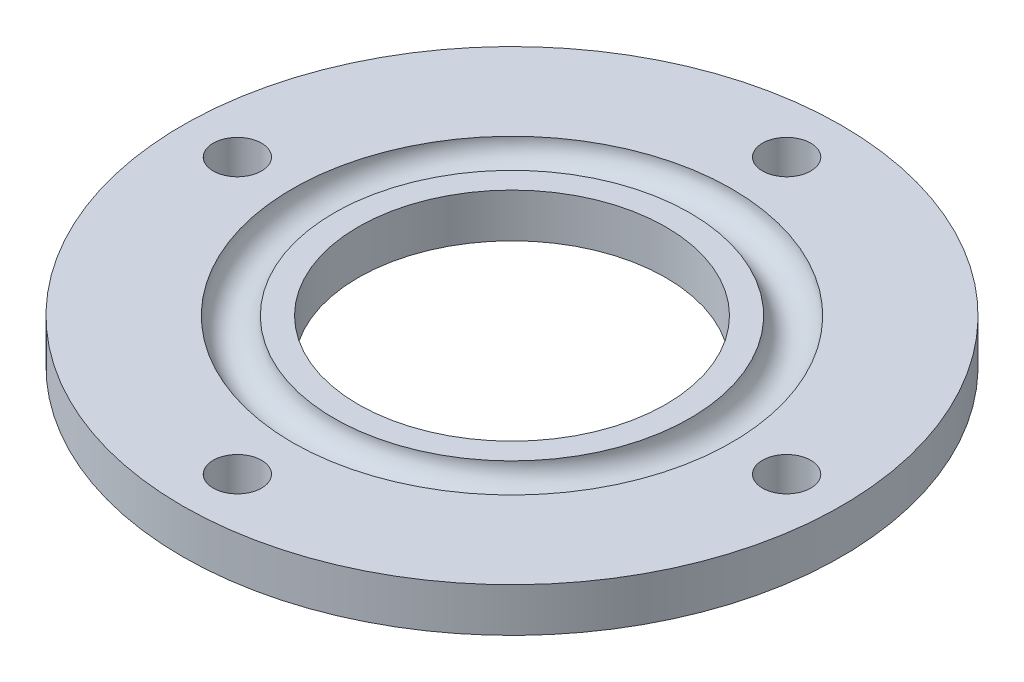
ISO-10303-21;
HEADER;
FILE_DESCRIPTION(('STEP AP214'),'2;1');
FILE_NAME('part.step','',(''),(''),'','','');
FILE_SCHEMA(('AUTOMOTIVE_DESIGN { 1 0 10303 214 1 1 1 1 }'));
ENDSEC;
DATA;
#1=APPLICATION_CONTEXT('core data for automotive mechanical design processes');
#2=APPLICATION_PROTOCOL_DEFINITION('international standard','automotive_design',2000,#1);
#3=PRODUCT_CONTEXT('',#1,'mechanical');
#4=PRODUCT('Part','Part','',(#3));
#5=PRODUCT_RELATED_PRODUCT_CATEGORY('part','',(#4));
#6=PRODUCT_DEFINITION_FORMATION('','',#4);
#7=PRODUCT_DEFINITION_CONTEXT('part definition',#1,'design');
#8=PRODUCT_DEFINITION('design','',#6,#7);
#9=PRODUCT_DEFINITION_SHAPE('','',#8);
#10=(LENGTH_UNIT() NAMED_UNIT(*) SI_UNIT(.MILLI.,.METRE.));
#11=(NAMED_UNIT(*) PLANE_ANGLE_UNIT() SI_UNIT($,.RADIAN.));
#12=(NAMED_UNIT(*) SI_UNIT($,.STERADIAN.) SOLID_ANGLE_UNIT());
#13=UNCERTAINTY_MEASURE_WITH_UNIT(LENGTH_MEASURE(1.E-05),#10,'distance_accuracy_value','');
#14=(GEOMETRIC_REPRESENTATION_CONTEXT(3) GLOBAL_UNCERTAINTY_ASSIGNED_CONTEXT((#13)) GLOBAL_UNIT_ASSIGNED_CONTEXT((#10,
#11,#12)) REPRESENTATION_CONTEXT('',''));
#15=CARTESIAN_POINT('',(0.,0.,0.));
#16=DIRECTION('',(0.,0.,1.));
#17=DIRECTION('',(1.,0.,0.));
#18=AXIS2_PLACEMENT_3D('',#15,#16,#17);
#19=CARTESIAN_POINT('',(0.,2.,0.));
#20=DIRECTION('',(0.,1.,0.));
#21=DIRECTION('',(0.,0.,1.));
#22=AXIS2_PLACEMENT_3D('',#19,#20,#21);
#23=PLANE('',#22);
#24=CARTESIAN_POINT('',(0.,2.,0.));
#25=DIRECTION('',(0.,1.,0.));
#26=DIRECTION('',(0.,0.,1.));
#27=AXIS2_PLACEMENT_3D('',#24,#25,#26);
#28=CIRCLE('',#27,15.);
#29=CARTESIAN_POINT('',(0.,2.,15.));
#30=VERTEX_POINT('',#29);
#31=EDGE_CURVE('E10',#30,#30,#28,.T.);
#32=ORIENTED_EDGE('',*,*,#31,.T.);
#33=EDGE_LOOP('',(#32));
#34=FACE_BOUND('',#33,.T.);
#35=CARTESIAN_POINT('',(12.5,2.,0.));
#36=DIRECTION('',(0.,1.,0.));
#37=DIRECTION('',(0.,0.,1.));
#38=AXIS2_PLACEMENT_3D('',#35,#36,#37);
#39=CIRCLE('',#38,1.1);
#40=CARTESIAN_POINT('',(12.5,2.,1.1));
#41=VERTEX_POINT('',#40);
#42=EDGE_CURVE('E72',#41,#41,#39,.T.);
#43=ORIENTED_EDGE('',*,*,#42,.F.);
#44=EDGE_LOOP('',(#43));
#45=FACE_BOUND('',#44,.T.);
#46=CARTESIAN_POINT('',(1.30930550206618E-13,2.,-12.5));
#47=DIRECTION('',(0.,1.,0.));
#48=DIRECTION('',(0.,0.,1.));
#49=AXIS2_PLACEMENT_3D('',#46,#47,#48);
#50=CIRCLE('',#49,1.1);
#51=CARTESIAN_POINT('',(1.30930550206618E-13,2.,-11.4));
#52=VERTEX_POINT('',#51);
#53=EDGE_CURVE('E57',#52,#52,#50,.T.);
#54=ORIENTED_EDGE('',*,*,#53,.F.);
#55=EDGE_LOOP('',(#54));
#56=FACE_BOUND('',#55,.T.);
#57=CARTESIAN_POINT('',(-12.5,2.,0.));
#58=DIRECTION('',(0.,1.,0.));
#59=DIRECTION('',(0.,0.,1.));
#60=AXIS2_PLACEMENT_3D('',#57,#58,#59);
#61=CIRCLE('',#60,1.1);
#62=CARTESIAN_POINT('',(-12.5,2.,1.09999999999991));
#63=VERTEX_POINT('',#62);
#64=EDGE_CURVE('E66',#63,#63,#61,.T.);
#65=ORIENTED_EDGE('',*,*,#64,.F.);
#66=EDGE_LOOP('',(#65));
#67=FACE_BOUND('',#66,.T.);
#68=CARTESIAN_POINT('',(0.,2.,12.5));
#69=DIRECTION('',(0.,1.,0.));
#70=DIRECTION('',(0.,0.,1.));
#71=AXIS2_PLACEMENT_3D('',#68,#69,#70);
#72=CIRCLE('',#71,1.1);
#73=CARTESIAN_POINT('',(0.,2.,13.6));
#74=VERTEX_POINT('',#73);
#75=EDGE_CURVE('E194',#74,#74,#72,.T.);
#76=ORIENTED_EDGE('',*,*,#75,.F.);
#77=EDGE_LOOP('',(#76));
#78=FACE_BOUND('',#77,.T.);
#79=CARTESIAN_POINT('',(0.,2.,0.));
#80=DIRECTION('',(0.,1.,0.));
#81=DIRECTION('',(0.,0.,1.));
#82=AXIS2_PLACEMENT_3D('',#79,#80,#81);
#83=CIRCLE('',#82,10.);
#84=CARTESIAN_POINT('',(0.,2.,10.));
#85=VERTEX_POINT('',#84);
#86=EDGE_CURVE('E38',#85,#85,#83,.T.);
#87=ORIENTED_EDGE('',*,*,#86,.F.);
#88=EDGE_LOOP('',(#87));
#89=FACE_BOUND('',#88,.T.);
#90=ADVANCED_FACE('F34',(#34,#45,#56,#67,#78,#89),#23,.T.);
#91=CARTESIAN_POINT('',(0.,2.,0.));
#92=DIRECTION('',(0.,1.,0.));
#93=DIRECTION('',(0.,0.,1.));
#94=AXIS2_PLACEMENT_3D('',#91,#92,#93);
#95=CIRCLE('',#94,7.);
#96=CARTESIAN_POINT('',(0.,2.,7.));
#97=VERTEX_POINT('',#96);
#98=EDGE_CURVE('E47',#97,#97,#95,.T.);
#99=ORIENTED_EDGE('',*,*,#98,.F.);
#100=EDGE_LOOP('',(#99));
#101=FACE_BOUND('',#100,.T.);
#102=CARTESIAN_POINT('',(0.,2.,0.));
#103=DIRECTION('',(0.,-1.,0.));
#104=DIRECTION('',(0.,0.,-1.));
#105=AXIS2_PLACEMENT_3D('',#102,#103,#104);
#106=CIRCLE('',#105,8.1);
#107=CARTESIAN_POINT('',(0.,2.,-8.1));
#108=VERTEX_POINT('',#107);
#109=EDGE_CURVE('E52',#108,#108,#106,.T.);
#110=ORIENTED_EDGE('',*,*,#109,.F.);
#111=EDGE_LOOP('',(#110));
#112=FACE_BOUND('',#111,.T.);
#113=ADVANCED_FACE('F100',(#101,#112),#23,.T.);
#114=CARTESIAN_POINT('',(0.,0.,0.));
#115=DIRECTION('',(0.,1.,0.));
#116=DIRECTION('',(0.,0.,1.));
#117=AXIS2_PLACEMENT_3D('',#114,#115,#116);
#118=PLANE('',#117);
#119=CARTESIAN_POINT('',(0.,0.,12.5));
#120=DIRECTION('',(0.,1.,0.));
#121=DIRECTION('',(0.,0.,1.));
#122=AXIS2_PLACEMENT_3D('',#119,#120,#121);
#123=CIRCLE('',#122,1.1);
#124=CARTESIAN_POINT('',(0.,0.,13.6));
#125=VERTEX_POINT('',#124);
#126=EDGE_CURVE('E76',#125,#125,#123,.F.);
#127=ORIENTED_EDGE('',*,*,#126,.F.);
#128=EDGE_LOOP('',(#127));
#129=FACE_BOUND('',#128,.T.);
#130=CARTESIAN_POINT('',(-12.5,0.,0.));
#131=DIRECTION('',(0.,1.,0.));
#132=DIRECTION('',(0.,0.,1.));
#133=AXIS2_PLACEMENT_3D('',#130,#131,#132);
#134=CIRCLE('',#133,1.1);
#135=CARTESIAN_POINT('',(-12.5,0.,1.09999999999991));
#136=VERTEX_POINT('',#135);
#137=EDGE_CURVE('E69',#136,#136,#134,.F.);
#138=ORIENTED_EDGE('',*,*,#137,.F.);
#139=EDGE_LOOP('',(#138));
#140=FACE_BOUND('',#139,.T.);
#141=CARTESIAN_POINT('',(1.30930550206618E-13,0.,-12.5));
#142=DIRECTION('',(0.,1.,0.));
#143=DIRECTION('',(0.,0.,1.));
#144=AXIS2_PLACEMENT_3D('',#141,#142,#143);
#145=CIRCLE('',#144,1.1);
#146=CARTESIAN_POINT('',(1.30930550206618E-13,0.,-11.4));
#147=VERTEX_POINT('',#146);
#148=EDGE_CURVE('E61',#147,#147,#145,.F.);
#149=ORIENTED_EDGE('',*,*,#148,.F.);
#150=EDGE_LOOP('',(#149));
#151=FACE_BOUND('',#150,.T.);
#152=CARTESIAN_POINT('',(12.5,0.,0.));
#153=DIRECTION('',(0.,1.,0.));
#154=DIRECTION('',(0.,0.,1.));
#155=AXIS2_PLACEMENT_3D('',#152,#153,#154);
#156=CIRCLE('',#155,1.1);
#157=CARTESIAN_POINT('',(12.5,0.,1.1));
#158=VERTEX_POINT('',#157);
#159=EDGE_CURVE('E75',#158,#158,#156,.F.);
#160=ORIENTED_EDGE('',*,*,#159,.F.);
#161=EDGE_LOOP('',(#160));
#162=FACE_BOUND('',#161,.T.);
#163=CARTESIAN_POINT('',(0.,0.,0.));
#164=DIRECTION('',(0.,1.,0.));
#165=DIRECTION('',(0.,0.,1.));
#166=AXIS2_PLACEMENT_3D('',#163,#164,#165);
#167=CIRCLE('',#166,15.);
#168=CARTESIAN_POINT('',(0.,0.,15.));
#169=VERTEX_POINT('',#168);
#170=EDGE_CURVE('E42',#169,#169,#167,.T.);
#171=ORIENTED_EDGE('',*,*,#170,.F.);
#172=EDGE_LOOP('',(#171));
#173=FACE_BOUND('',#172,.T.);
#174=CARTESIAN_POINT('',(0.,0.,0.));
#175=DIRECTION('',(0.,1.,0.));
#176=DIRECTION('',(0.,0.,1.));
#177=AXIS2_PLACEMENT_3D('',#174,#175,#176);
#178=CIRCLE('',#177,7.);
#179=CARTESIAN_POINT('',(0.,0.,7.));
#180=VERTEX_POINT('',#179);
#181=EDGE_CURVE('E50',#180,#180,#178,.T.);
#182=ORIENTED_EDGE('',*,*,#181,.T.);
#183=EDGE_LOOP('',(#182));
#184=FACE_BOUND('',#183,.T.);
#185=ADVANCED_FACE('F84',(#129,#140,#151,#162,#173,#184),#118,.F.);
#186=CARTESIAN_POINT('',(0.,2.,0.));
#187=DIRECTION('',(0.,-1.,0.));
#188=DIRECTION('',(0.,0.,-1.));
#189=AXIS2_PLACEMENT_3D('',#186,#187,#188);
#190=CYLINDRICAL_SURFACE('',#189,15.);
#191=ORIENTED_EDGE('',*,*,#31,.F.);
#192=EDGE_LOOP('',(#191));
#193=FACE_BOUND('',#192,.T.);
#194=ORIENTED_EDGE('',*,*,#170,.T.);
#195=EDGE_LOOP('',(#194));
#196=FACE_BOUND('',#195,.T.);
#197=ADVANCED_FACE('F36',(#193,#196),#190,.T.);
#198=CARTESIAN_POINT('',(0.,2.,0.));
#199=DIRECTION('',(0.,-1.,0.));
#200=DIRECTION('',(0.,0.,-1.));
#201=AXIS2_PLACEMENT_3D('',#198,#199,#200);
#202=CYLINDRICAL_SURFACE('',#201,7.);
#203=ORIENTED_EDGE('',*,*,#98,.T.);
#204=EDGE_LOOP('',(#203));
#205=FACE_BOUND('',#204,.T.);
#206=ORIENTED_EDGE('',*,*,#181,.F.);
#207=EDGE_LOOP('',(#206));
#208=FACE_BOUND('',#207,.T.);
#209=ADVANCED_FACE('F86',(#205,#208),#202,.F.);
#210=CARTESIAN_POINT('',(12.5,-0.00100000000000013,0.));
#211=DIRECTION('',(0.,1.,0.));
#212=DIRECTION('',(0.,0.,1.));
#213=AXIS2_PLACEMENT_3D('',#210,#211,#212);
#214=CYLINDRICAL_SURFACE('',#213,1.1);
#215=ORIENTED_EDGE('',*,*,#42,.T.);
#216=EDGE_LOOP('',(#215));
#217=FACE_BOUND('',#216,.T.);
#218=ORIENTED_EDGE('',*,*,#159,.T.);
#219=EDGE_LOOP('',(#218));
#220=FACE_BOUND('',#219,.T.);
#221=ADVANCED_FACE('F88',(#217,#220),#214,.F.);
#222=CARTESIAN_POINT('',(1.30930550206618E-13,-0.00100000000000013,-12.5));
#223=DIRECTION('',(0.,1.,0.));
#224=DIRECTION('',(0.,0.,1.));
#225=AXIS2_PLACEMENT_3D('',#222,#223,#224);
#226=CYLINDRICAL_SURFACE('',#225,1.1);
#227=ORIENTED_EDGE('',*,*,#53,.T.);
#228=EDGE_LOOP('',(#227));
#229=FACE_BOUND('',#228,.T.);
#230=ORIENTED_EDGE('',*,*,#148,.T.);
#231=EDGE_LOOP('',(#230));
#232=FACE_BOUND('',#231,.T.);
#233=ADVANCED_FACE('F94',(#229,#232),#226,.F.);
#234=CARTESIAN_POINT('',(-12.5,-0.00100000000000013,0.));
#235=DIRECTION('',(0.,1.,0.));
#236=DIRECTION('',(0.,0.,1.));
#237=AXIS2_PLACEMENT_3D('',#234,#235,#236);
#238=CYLINDRICAL_SURFACE('',#237,1.1);
#239=ORIENTED_EDGE('',*,*,#64,.T.);
#240=EDGE_LOOP('',(#239));
#241=FACE_BOUND('',#240,.T.);
#242=ORIENTED_EDGE('',*,*,#137,.T.);
#243=EDGE_LOOP('',(#242));
#244=FACE_BOUND('',#243,.T.);
#245=ADVANCED_FACE('F125',(#241,#244),#238,.F.);
#246=CARTESIAN_POINT('',(0.,-0.00100000000000013,12.5));
#247=DIRECTION('',(0.,1.,0.));
#248=DIRECTION('',(0.,0.,1.));
#249=AXIS2_PLACEMENT_3D('',#246,#247,#248);
#250=CYLINDRICAL_SURFACE('',#249,1.1);
#251=ORIENTED_EDGE('',*,*,#75,.T.);
#252=EDGE_LOOP('',(#251));
#253=FACE_BOUND('',#252,.T.);
#254=ORIENTED_EDGE('',*,*,#126,.T.);
#255=EDGE_LOOP('',(#254));
#256=FACE_BOUND('',#255,.T.);
#257=ADVANCED_FACE('F130',(#253,#256),#250,.F.);
#258=CARTESIAN_POINT('',(0.,2.,0.));
#259=DIRECTION('',(0.,-1.,0.));
#260=DIRECTION('',(0.,0.,-1.));
#261=AXIS2_PLACEMENT_3D('',#258,#259,#260);
#262=TOROIDAL_SURFACE('',#261,9.05,0.949999999999999);
#263=ORIENTED_EDGE('',*,*,#86,.T.);
#264=EDGE_LOOP('',(#263));
#265=FACE_BOUND('',#264,.T.);
#266=ORIENTED_EDGE('',*,*,#109,.T.);
#267=EDGE_LOOP('',(#266));
#268=FACE_BOUND('',#267,.T.);
#269=ADVANCED_FACE('F136',(#265,#268),#262,.F.);
#270=CLOSED_SHELL('',(#90,#113,#185,#197,#209,#221,#233,#245,#257,#269));
#271=MANIFOLD_SOLID_BREP('B2',#270);
#272=ADVANCED_BREP_SHAPE_REPRESENTATION('',(#18,#271),#14);
#273=SHAPE_DEFINITION_REPRESENTATION(#9,#272);
ENDSEC;
END-ISO-10303-21;
